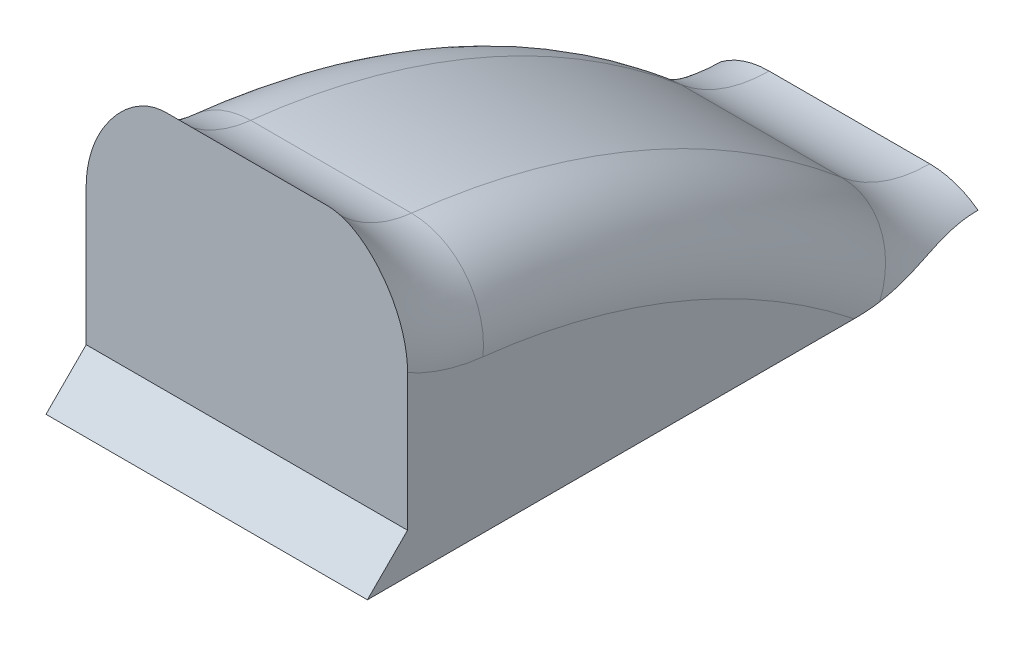
ISO-10303-21;
HEADER;
FILE_DESCRIPTION(('STEP AP214'),'2;1');
FILE_NAME('part.step','',(''),(''),'','','');
FILE_SCHEMA(('AUTOMOTIVE_DESIGN { 1 0 10303 214 1 1 1 1 }'));
ENDSEC;
DATA;
#1=APPLICATION_CONTEXT('core data for automotive mechanical design processes');
#2=APPLICATION_PROTOCOL_DEFINITION('international standard','automotive_design',2000,#1);
#3=PRODUCT_CONTEXT('',#1,'mechanical');
#4=PRODUCT('Part','Part','',(#3));
#5=PRODUCT_RELATED_PRODUCT_CATEGORY('part','',(#4));
#6=PRODUCT_DEFINITION_FORMATION('','',#4);
#7=PRODUCT_DEFINITION_CONTEXT('part definition',#1,'design');
#8=PRODUCT_DEFINITION('design','',#6,#7);
#9=PRODUCT_DEFINITION_SHAPE('','',#8);
#10=(LENGTH_UNIT() NAMED_UNIT(*) SI_UNIT(.MILLI.,.METRE.));
#11=(NAMED_UNIT(*) PLANE_ANGLE_UNIT() SI_UNIT($,.RADIAN.));
#12=(NAMED_UNIT(*) SI_UNIT($,.STERADIAN.) SOLID_ANGLE_UNIT());
#13=UNCERTAINTY_MEASURE_WITH_UNIT(LENGTH_MEASURE(1.E-05),#10,'distance_accuracy_value','');
#14=(GEOMETRIC_REPRESENTATION_CONTEXT(3) GLOBAL_UNCERTAINTY_ASSIGNED_CONTEXT((#13)) GLOBAL_UNIT_ASSIGNED_CONTEXT((#10,
#11,#12)) REPRESENTATION_CONTEXT('',''));
#15=CARTESIAN_POINT('',(0.,0.,0.));
#16=DIRECTION('',(0.,0.,1.));
#17=DIRECTION('',(1.,0.,0.));
#18=AXIS2_PLACEMENT_3D('',#15,#16,#17);
#19=CARTESIAN_POINT('',(1.4,0.05,-0.75));
#20=DIRECTION('',(0.,0.,-1.));
#21=DIRECTION('',(-1.,0.,0.));
#22=AXIS2_PLACEMENT_3D('',#19,#20,#21);
#23=PLANE('',#22);
#24=CARTESIAN_POINT('',(1.29999999996371,0.349999999048817,-0.75));
#25=CARTESIAN_POINT('',(1.30366682566644,0.350010962555197,-0.75));
#26=CARTESIAN_POINT('',(1.30731760266918,0.349658484663443,-0.75));
#27=CARTESIAN_POINT('',(1.31445963130488,0.348333875905218,-0.75));
#28=CARTESIAN_POINT('',(1.31795231543141,0.347369627937569,-0.75));
#29=CARTESIAN_POINT('',(1.32581573405073,0.344539445193765,-0.75));
#30=CARTESIAN_POINT('',(1.33011724918364,0.342485325432599,-0.75));
#31=CARTESIAN_POINT('',(1.33836316301625,0.337722435202768,-0.75));
#32=CARTESIAN_POINT('',(1.34230508863756,0.335009541820298,-0.75));
#33=CARTESIAN_POINT('',(1.35180524001793,0.327545085025619,-0.75));
#34=CARTESIAN_POINT('',(1.35711237091318,0.322475224327267,-0.75));
#35=CARTESIAN_POINT('',(1.36687316443516,0.311585153751797,-0.75));
#36=CARTESIAN_POINT('',(1.37132636992714,0.305764544747223,-0.75));
#37=CARTESIAN_POINT('',(1.37952039118134,0.29330547380315,-0.75));
#38=CARTESIAN_POINT('',(1.38322575195117,0.286643665515981,-0.75));
#39=CARTESIAN_POINT('',(1.38960767096419,0.272857237837241,-0.75));
#40=CARTESIAN_POINT('',(1.39228606539241,0.265733471338296,-0.75));
#41=CARTESIAN_POINT('',(1.39621596370115,0.25218259791091,-0.75));
#42=CARTESIAN_POINT('',(1.39761519714484,0.245798474934751,-0.75));
#43=CARTESIAN_POINT('',(1.39950882532757,0.232881794895136,-0.75));
#44=CARTESIAN_POINT('',(1.40000086172964,0.226348895527605,-0.75));
#45=CARTESIAN_POINT('',(1.40000000021831,0.219805740269375,-0.75));
#46=B_SPLINE_CURVE_WITH_KNOTS('',3,(#24,#25,#26,#27,#28,#29,#30,#31,#32,#33,#34,#35,#36,#37,#38,
#39,#40,#41,#42,#43,#44,#45),.UNSPECIFIED.,.F.,.F.,(4,2,2,2,2,2,2,2,2,2,4),(0.,
0.0109577763831861,0.0217771481085664,0.0359984240459981,0.0503111074095379,0.0722120094925669,
0.0941246033261917,0.116910300510462,0.139655065433205,0.159200017895955,0.178795707897026),.UNSPECIFIED.);
#47=CARTESIAN_POINT('',(1.29999999998186,0.349999999524409,-0.75));
#48=VERTEX_POINT('',#47);
#49=CARTESIAN_POINT('',(1.40000000010916,0.219805740269375,-0.75));
#50=VERTEX_POINT('',#49);
#51=EDGE_CURVE('E117',#48,#50,#46,.T.);
#52=ORIENTED_EDGE('',*,*,#51,.F.);
#53=DIRECTION('',(1.,0.,0.));
#54=VECTOR('',#53,1.);
#55=CARTESIAN_POINT('',(1.2,0.35,-0.75));
#56=LINE('',#55,#54);
#57=CARTESIAN_POINT('',(1.1,0.350000000083016,-0.75));
#58=VERTEX_POINT('',#57);
#59=EDGE_CURVE('E41',#58,#48,#56,.T.);
#60=ORIENTED_EDGE('',*,*,#59,.F.);
#61=CARTESIAN_POINT('',(0.999999999564274,0.219805740269378,-0.749999999853243));
#62=CARTESIAN_POINT('',(0.999998247766929,0.228360205075033,-0.749999999947539));
#63=CARTESIAN_POINT('',(1.00083907547772,0.236890868325082,-0.749999999986003));
#64=CARTESIAN_POINT('',(1.00403300277483,0.253635510569335,-0.750000000013946));
#65=CARTESIAN_POINT('',(1.00638055336717,0.261850534825952,-0.750000000003605));
#66=CARTESIAN_POINT('',(1.01220041097918,0.277188840827321,-0.749999999996654));
#67=CARTESIAN_POINT('',(1.0155796888797,0.284348148963261,-0.74999999999911));
#68=CARTESIAN_POINT('',(1.02339322518595,0.298081117314659,-0.750000000000891));
#69=CARTESIAN_POINT('',(1.02782863452238,0.304654127788376,-0.750000000000214));
#70=CARTESIAN_POINT('',(1.03670776148319,0.315770663251716,-0.749999999999829));
#71=CARTESIAN_POINT('',(1.04097302465008,0.320457374099743,-0.749999999999955));
#72=CARTESIAN_POINT('',(1.05014819138823,0.329156288238541,-0.750000000000045));
#73=CARTESIAN_POINT('',(1.05505698911544,0.333169622278239,-0.75000000000001));
#74=CARTESIAN_POINT('',(1.06366308687047,0.338952671086247,-0.749999999999994));
#75=CARTESIAN_POINT('',(1.06716543545747,0.341011363278786,-0.749999999999998));
#76=CARTESIAN_POINT('',(1.07442725250088,0.344585835244453,-0.750000000000002));
#77=CARTESIAN_POINT('',(1.07818555973303,0.346103894737468,-0.750000000000001));
#78=CARTESIAN_POINT('',(1.08494487476547,0.348151878770666,-0.75));
#79=CARTESIAN_POINT('',(1.08789921415163,0.348834180603575,-0.75));
#80=CARTESIAN_POINT('',(1.09389957039469,0.349763089770758,-0.75));
#81=CARTESIAN_POINT('',(1.09694614249501,0.350006056352736,-0.75));
#82=CARTESIAN_POINT('',(1.1,0.350000000166031,-0.75));
#83=B_SPLINE_CURVE_WITH_KNOTS('',3,(#61,#62,#63,#64,#65,#66,#67,#68,#69,#70,#71,#72,#73,#74,#75,
#76,#77,#78,#79,#80,#81,#82),.UNSPECIFIED.,.F.,.F.,(4,2,2,2,2,2,2,2,2,2,4),(0.,
0.0255893031406178,0.0510849019833463,0.0747469625988365,0.0984349281763469,0.117393594776988,
0.136320099849681,0.148474726827418,0.160577476227118,0.169642719987766,0.178782748632698),.UNSPECIFIED.);
#84=CARTESIAN_POINT('',(0.999999999708758,0.219805740269378,-0.75));
#85=VERTEX_POINT('',#84);
#86=EDGE_CURVE('E130',#85,#58,#83,.T.);
#87=ORIENTED_EDGE('',*,*,#86,.F.);
#88=DIRECTION('',(0.,1.,0.));
#89=VECTOR('',#88,1.);
#90=CARTESIAN_POINT('',(1.,0.2,-0.75));
#91=LINE('',#90,#89);
#92=CARTESIAN_POINT('',(1.,0.0499999998261114,-0.75));
#93=VERTEX_POINT('',#92);
#94=EDGE_CURVE('E123',#93,#85,#91,.T.);
#95=ORIENTED_EDGE('',*,*,#94,.F.);
#96=DIRECTION('',(-1.,0.,0.));
#97=VECTOR('',#96,1.);
#98=CARTESIAN_POINT('',(1.2,0.05,-0.75));
#99=LINE('',#98,#97);
#100=CARTESIAN_POINT('',(1.4,0.05,-0.75));
#101=VERTEX_POINT('',#100);
#102=EDGE_CURVE('E255',#101,#93,#99,.T.);
#103=ORIENTED_EDGE('',*,*,#102,.F.);
#104=DIRECTION('',(0.,-1.,0.));
#105=VECTOR('',#104,1.);
#106=CARTESIAN_POINT('',(1.4,0.2,-0.75));
#107=LINE('',#106,#105);
#108=EDGE_CURVE('E10',#50,#101,#107,.T.);
#109=ORIENTED_EDGE('',*,*,#108,.F.);
#110=EDGE_LOOP('',(#52,#60,#87,#95,#103,#109));
#111=FACE_BOUND('',#110,.T.);
#112=ADVANCED_FACE('F16',(#111),#23,.F.);
#113=CARTESIAN_POINT('',(1.4,0.,-1.309526902));
#114=DIRECTION('',(-1.,0.,0.));
#115=DIRECTION('',(0.,0.,1.));
#116=AXIS2_PLACEMENT_3D('',#113,#114,#115);
#117=PLANE('',#116);
#118=CARTESIAN_POINT('',(1.39999999320173,0.438519467857527,-0.871096251859432));
#119=DIRECTION('',(1.,2.73948942281327E-08,-7.89732137757077E-09));
#120=DIRECTION('',(0.,-0.276997062709012,-0.960870765113904));
#121=AXIS2_PLACEMENT_3D('',#118,#119,#120);
#122=CIRCLE('',#121,0.249999993632357);
#123=CARTESIAN_POINT('',(1.40000000022456,0.190002523524586,-0.843905716822467));
#124=VERTEX_POINT('',#123);
#125=EDGE_CURVE('E119',#50,#124,#122,.T.);
#126=ORIENTED_EDGE('',*,*,#125,.F.);
#127=ORIENTED_EDGE('',*,*,#108,.T.);
#128=DIRECTION('',(0.,0.707106781186547,-0.707106781186548));
#129=VECTOR('',#128,1.);
#130=CARTESIAN_POINT('',(1.4,0.,-0.7));
#131=LINE('',#130,#129);
#132=CARTESIAN_POINT('',(1.4,0.,-0.7));
#133=VERTEX_POINT('',#132);
#134=EDGE_CURVE('E280',#133,#101,#131,.T.);
#135=ORIENTED_EDGE('',*,*,#134,.F.);
#136=DIRECTION('',(0.,0.,1.));
#137=VECTOR('',#136,1.);
#138=CARTESIAN_POINT('',(1.4,0.,-1.0029457765));
#139=LINE('',#138,#137);
#140=CARTESIAN_POINT('',(1.4000000001497,1.06729968966029E-10,-1.30589155215729));
#141=VERTEX_POINT('',#140);
#142=EDGE_CURVE('E135',#141,#133,#139,.T.);
#143=ORIENTED_EDGE('',*,*,#142,.F.);
#144=CARTESIAN_POINT('',(1.39999999677782,-0.70465850155761,-0.746019778698697));
#145=DIRECTION('',(-1.,3.70363621067252E-09,-1.36118372827333E-09));
#146=DIRECTION('',(-1.36118372827333E-09,0.,1.));
#147=AXIS2_PLACEMENT_3D('',#144,#145,#146);
#148=CIRCLE('',#147,0.900000003713054);
#149=EDGE_CURVE('E138',#124,#141,#148,.T.);
#150=ORIENTED_EDGE('',*,*,#149,.F.);
#151=EDGE_LOOP('',(#126,#127,#135,#143,#150));
#152=FACE_BOUND('',#151,.T.);
#153=ADVANCED_FACE('F166',(#152),#117,.F.);
#154=CARTESIAN_POINT('',(1.30000000238547,0.438519488332813,-0.871096262749537));
#155=DIRECTION('',(-1.,9.58108774694143E-09,-5.57717039422708E-09));
#156=DIRECTION('',(-5.57717039422708E-09,0.,1.));
#157=AXIS2_PLACEMENT_3D('',#154,#155,#156);
#158=TOROIDAL_SURFACE('',#157,0.250000016720414,0.100000000603734);
#159=CARTESIAN_POINT('',(1.29999999934489,0.190002522654574,-0.843905716892939));
#160=DIRECTION('',(-1.64677748686025E-09,0.108762150041584,0.99406780187185));
#161=DIRECTION('',(1.,1.51410898573687E-08,0.));
#162=AXIS2_PLACEMENT_3D('',#159,#160,#161);
#163=CIRCLE('',#162,0.100000000879662);
#164=CARTESIAN_POINT('',(1.3,0.289409303716203,-0.854781931992771));
#165=VERTEX_POINT('',#164);
#166=EDGE_CURVE('E32',#124,#165,#163,.T.);
#167=ORIENTED_EDGE('',*,*,#166,.T.);
#168=CARTESIAN_POINT('',(1.3,0.438519474,-0.871096254));
#169=DIRECTION('',(-1.,0.,0.));
#170=DIRECTION('',(0.,0.,1.));
#171=AXIS2_PLACEMENT_3D('',#168,#169,#170);
#172=CIRCLE('',#171,0.15);
#173=EDGE_CURVE('E115',#165,#48,#172,.T.);
#174=ORIENTED_EDGE('',*,*,#173,.T.);
#175=ORIENTED_EDGE('',*,*,#51,.T.);
#176=ORIENTED_EDGE('',*,*,#125,.T.);
#177=EDGE_LOOP('',(#167,#174,#175,#176));
#178=FACE_BOUND('',#177,.T.);
#179=ADVANCED_FACE('F162',(#178),#158,.T.);
#180=CARTESIAN_POINT('',(1.3,0.438519474,-0.871096254));
#181=DIRECTION('',(-1.,0.,0.));
#182=DIRECTION('',(0.,0.,1.));
#183=AXIS2_PLACEMENT_3D('',#180,#181,#182);
#184=CYLINDRICAL_SURFACE('',#183,0.15);
#185=DIRECTION('',(-1.,0.,0.));
#186=VECTOR('',#185,1.);
#187=CARTESIAN_POINT('',(1.2,0.28940930373128,-0.854781931383557));
#188=LINE('',#187,#186);
#189=CARTESIAN_POINT('',(1.1,0.289409303740005,-0.854781931735455));
#190=VERTEX_POINT('',#189);
#191=EDGE_CURVE('E122',#165,#190,#188,.T.);
#192=ORIENTED_EDGE('',*,*,#191,.T.);
#193=CARTESIAN_POINT('',(1.1,0.438519474,-0.871096254));
#194=DIRECTION('',(-1.,0.,0.));
#195=DIRECTION('',(0.,0.,1.));
#196=AXIS2_PLACEMENT_3D('',#193,#194,#195);
#197=CIRCLE('',#196,0.15);
#198=EDGE_CURVE('E113',#190,#58,#197,.T.);
#199=ORIENTED_EDGE('',*,*,#198,.T.);
#200=ORIENTED_EDGE('',*,*,#59,.T.);
#201=ORIENTED_EDGE('',*,*,#173,.F.);
#202=EDGE_LOOP('',(#192,#199,#200,#201));
#203=FACE_BOUND('',#202,.T.);
#204=ADVANCED_FACE('F165',(#203),#184,.F.);
#205=CARTESIAN_POINT('',(1.10000000435835,0.438519474164285,-0.871096254107821));
#206=DIRECTION('',(-1.,1.32995734944344E-08,-1.07817005528664E-08));
#207=DIRECTION('',(-1.07817005528664E-08,0.,1.));
#208=AXIS2_PLACEMENT_3D('',#205,#206,#207);
#209=TOROIDAL_SURFACE('',#208,0.250000000845989,0.100000000726411);
#210=CARTESIAN_POINT('',(1.1000000006488,0.190002522694578,-0.843905716545499));
#211=DIRECTION('',(-1.85051383629767E-09,0.108762150949675,0.994067801772495));
#212=DIRECTION('',(1.,1.70143181257413E-08,0.));
#213=AXIS2_PLACEMENT_3D('',#210,#211,#212);
#214=CIRCLE('',#213,0.100000000873359);
#215=CARTESIAN_POINT('',(0.999999999775443,0.190002523524592,-0.843905716822468));
#216=VERTEX_POINT('',#215);
#217=EDGE_CURVE('E114',#190,#216,#214,.T.);
#218=ORIENTED_EDGE('',*,*,#217,.T.);
#219=CARTESIAN_POINT('',(1.00000000679827,0.438519467857873,-0.871096251859535));
#220=DIRECTION('',(-1.,2.73949080004724E-08,-7.89732427070734E-09));
#221=DIRECTION('',(-7.89732427070735E-09,0.,1.));
#222=AXIS2_PLACEMENT_3D('',#219,#220,#221);
#223=CIRCLE('',#222,0.249999993632707);
#224=EDGE_CURVE('E127',#216,#85,#223,.T.);
#225=ORIENTED_EDGE('',*,*,#224,.T.);
#226=ORIENTED_EDGE('',*,*,#86,.T.);
#227=ORIENTED_EDGE('',*,*,#198,.F.);
#228=EDGE_LOOP('',(#218,#225,#226,#227));
#229=FACE_BOUND('',#228,.T.);
#230=ADVANCED_FACE('F168',(#229),#209,.T.);
#231=CARTESIAN_POINT('',(1.,0.,-1.309526902));
#232=DIRECTION('',(-1.,0.,0.));
#233=DIRECTION('',(0.,0.,1.));
#234=AXIS2_PLACEMENT_3D('',#231,#232,#233);
#235=PLANE('',#234);
#236=DIRECTION('',(0.,0.,1.));
#237=VECTOR('',#236,1.);
#238=CARTESIAN_POINT('',(1.,0.,-1.0029457765));
#239=LINE('',#238,#237);
#240=CARTESIAN_POINT('',(0.999999999850296,1.06732190671243E-10,-1.30589155215729));
#241=VERTEX_POINT('',#240);
#242=CARTESIAN_POINT('',(1.,0.,-0.700000000232245));
#243=VERTEX_POINT('',#242);
#244=EDGE_CURVE('E257',#241,#243,#239,.T.);
#245=ORIENTED_EDGE('',*,*,#244,.T.);
#246=DIRECTION('',(0.,0.707106782011833,-0.707106780361262));
#247=VECTOR('',#246,1.);
#248=CARTESIAN_POINT('',(1.,0.,-0.70000000046449));
#249=LINE('',#248,#247);
#250=EDGE_CURVE('E125',#243,#93,#249,.T.);
#251=ORIENTED_EDGE('',*,*,#250,.T.);
#252=ORIENTED_EDGE('',*,*,#94,.T.);
#253=ORIENTED_EDGE('',*,*,#224,.F.);
#254=CARTESIAN_POINT('',(0.999999999625734,-0.704658501731185,-0.746019778627308));
#255=DIRECTION('',(-1.,0.,0.));
#256=DIRECTION('',(0.,0.,1.));
#257=AXIS2_PLACEMENT_3D('',#254,#255,#256);
#258=CIRCLE('',#257,0.900000003893368);
#259=EDGE_CURVE('E126',#216,#241,#258,.T.);
#260=ORIENTED_EDGE('',*,*,#259,.T.);
#261=EDGE_LOOP('',(#245,#251,#252,#253,#260));
#262=FACE_BOUND('',#261,.T.);
#263=ADVANCED_FACE('F172',(#262),#235,.T.);
#264=CARTESIAN_POINT('',(1.,0.,-0.7));
#265=DIRECTION('',(0.,-0.707106781186548,-0.707106781186547));
#266=DIRECTION('',(0.,0.707106781186547,-0.707106781186548));
#267=AXIS2_PLACEMENT_3D('',#264,#265,#266);
#268=PLANE('',#267);
#269=DIRECTION('',(-1.,0.,0.));
#270=VECTOR('',#269,1.);
#271=CARTESIAN_POINT('',(1.2,0.,-0.7));
#272=LINE('',#271,#270);
#273=EDGE_CURVE('E142',#133,#243,#272,.T.);
#274=ORIENTED_EDGE('',*,*,#273,.F.);
#275=ORIENTED_EDGE('',*,*,#134,.T.);
#276=ORIENTED_EDGE('',*,*,#102,.T.);
#277=ORIENTED_EDGE('',*,*,#250,.F.);
#278=EDGE_LOOP('',(#274,#275,#276,#277));
#279=FACE_BOUND('',#278,.T.);
#280=ADVANCED_FACE('F176',(#279),#268,.F.);
#281=CARTESIAN_POINT('',(1.29999998873894,-0.704658501672842,-0.746019779083307));
#282=DIRECTION('',(-1.,1.12063119226131E-08,-5.33132747395985E-09));
#283=DIRECTION('',(-5.33132747395985E-09,0.,1.));
#284=AXIS2_PLACEMENT_3D('',#281,#282,#283);
#285=TOROIDAL_SURFACE('',#284,0.900000003158881,0.100000000659206);
#286=CARTESIAN_POINT('',(1.3,-0.704658498,-0.746019781));
#287=DIRECTION('',(1.,0.,0.));
#288=DIRECTION('',(0.,1.,0.));
#289=AXIS2_PLACEMENT_3D('',#286,#287,#288);
#290=CIRCLE('',#289,1.);
#291=CARTESIAN_POINT('',(1.29999999983795,0.0600068855505894,-1.39044731903608));
#292=VERTEX_POINT('',#291);
#293=EDGE_CURVE('E269',#292,#165,#290,.T.);
#294=ORIENTED_EDGE('',*,*,#293,.T.);
#295=ORIENTED_EDGE('',*,*,#166,.F.);
#296=ORIENTED_EDGE('',*,*,#149,.T.);
#297=CARTESIAN_POINT('',(1.26725378279648,4.82933203578017E-06,-1.26792166906526));
#298=DIRECTION('',(3.56775383122088E-05,0.999999999360546,-2.45370887951204E-06));
#299=DIRECTION('',(-0.251034196127656,1.13314189081304E-05,0.967978218890353));
#300=AXIS2_PLACEMENT_3D('',#297,#298,#299);
#301=ELLIPSE('',#300,0.192501481850988,0.127727873122096);
#302=CARTESIAN_POINT('',(1.39765583122285,1.76410812414225E-10,-1.33987606238192));
#303=VERTEX_POINT('',#302);
#304=EDGE_CURVE('E134',#141,#303,#301,.T.);
#305=ORIENTED_EDGE('',*,*,#304,.T.);
#306=CARTESIAN_POINT('',(1.30000000008808,-0.016459653035172,-1.32600456474559));
#307=DIRECTION('',(2.21490811533198E-09,0.644427539559284,0.764665381887769));
#308=DIRECTION('',(1.,-3.43701654470995E-09,0.));
#309=AXIS2_PLACEMENT_3D('',#306,#307,#308);
#310=CIRCLE('',#309,0.0999999999257083);
#311=EDGE_CURVE('E132',#303,#292,#310,.T.);
#312=ORIENTED_EDGE('',*,*,#311,.T.);
#313=EDGE_LOOP('',(#294,#295,#296,#305,#312));
#314=FACE_BOUND('',#313,.T.);
#315=ADVANCED_FACE('F180',(#314),#285,.T.);
#316=CARTESIAN_POINT('',(1.,0.,-1.5));
#317=DIRECTION('',(0.,1.,0.));
#318=DIRECTION('',(0.,0.,1.));
#319=AXIS2_PLACEMENT_3D('',#316,#317,#318);
#320=PLANE('',#319);
#321=CARTESIAN_POINT('',(1.39765583143209,7.75888527726202E-12,-1.33987606242378));
#322=CARTESIAN_POINT('',(1.39574329210156,2.79853312034865E-12,-1.35359765542458));
#323=CARTESIAN_POINT('',(1.39270495277309,7.525616730333E-13,-1.36701330806974));
#324=CARTESIAN_POINT('',(1.38547676963315,-7.50718087568285E-13,-1.39351273770047));
#325=CARTESIAN_POINT('',(1.38128976494919,-2.1435568997034E-13,-1.40659724718638));
#326=CARTESIAN_POINT('',(1.37285246859131,2.13940822870456E-13,-1.43275323014791));
#327=CARTESIAN_POINT('',(1.36860231508774,1.07120164801319E-13,-1.44582467984127));
#328=CARTESIAN_POINT('',(1.36218375676619,-1.07420511300137E-13,-1.47244941745509));
#329=CARTESIAN_POINT('',(1.36002122222544,-2.1514221121763E-13,-1.48600395360643));
#330=CARTESIAN_POINT('',(1.36000000199714,0.,-1.50000000003934));
#331=B_SPLINE_CURVE_WITH_KNOTS('',3,(#321,#322,#323,#324,#325,#326,#327,#328,#329,#330),
.UNSPECIFIED.,.F.,.F.,(4,2,2,2,4),(0.,0.041301985462867,0.0825027915463647,0.123623856994402,
0.16486021882968),.UNSPECIFIED.);
#332=CARTESIAN_POINT('',(1.36000000103883,0.,-1.5));
#333=VERTEX_POINT('',#332);
#334=EDGE_CURVE('E144',#303,#333,#331,.T.);
#335=ORIENTED_EDGE('',*,*,#334,.F.);
#336=ORIENTED_EDGE('',*,*,#304,.F.);
#337=ORIENTED_EDGE('',*,*,#142,.T.);
#338=ORIENTED_EDGE('',*,*,#273,.T.);
#339=ORIENTED_EDGE('',*,*,#244,.F.);
#340=CARTESIAN_POINT('',(1.13274621592142,4.82934049348366E-06,-1.26792166955495));
#341=DIRECTION('',(-3.56776011007931E-05,0.999999999360544,-2.45371328976826E-06));
#342=DIRECTION('',(0.251034191826607,1.133143878853E-05,0.967978220005781));
#343=AXIS2_PLACEMENT_3D('',#340,#341,#342);
#344=ELLIPSE('',#343,0.192501480751404,0.127727871998602);
#345=CARTESIAN_POINT('',(1.00234416836825,1.76407778150509E-10,-1.33987606246848));
#346=VERTEX_POINT('',#345);
#347=EDGE_CURVE('E139',#346,#241,#344,.T.);
#348=ORIENTED_EDGE('',*,*,#347,.F.);
#349=CARTESIAN_POINT('',(1.03999999965055,-6.56253063279773E-11,-1.5));
#350=CARTESIAN_POINT('',(1.04004597569619,-2.33406330731563E-11,-1.48930345575476));
#351=CARTESIAN_POINT('',(1.03875440539985,-6.20062217714809E-12,-1.47880084529949));
#352=CARTESIAN_POINT('',(1.03460612218242,6.1852339416473E-12,-1.45810774816051));
#353=CARTESIAN_POINT('',(1.03175330146874,1.48530888563393E-12,-1.44791655155673));
#354=CARTESIAN_POINT('',(1.02619964198971,-1.18788775882662E-12,-1.42974070668906));
#355=CARTESIAN_POINT('',(1.02358275914032,-3.19665350618915E-13,-1.42172284962131));
#356=CARTESIAN_POINT('',(1.01842761828237,3.19201687154103E-13,-1.4056684531106));
#357=CARTESIAN_POINT('',(1.01588925173673,0.,-1.39763195763414));
#358=CARTESIAN_POINT('',(1.01115366448675,0.,-1.38140817505881));
#359=CARTESIAN_POINT('',(1.00895832138597,0.,-1.37322031482557));
#360=CARTESIAN_POINT('',(1.00514951874,0.,-1.35667382996041));
#361=CARTESIAN_POINT('',(1.00353876184194,0.,-1.34831459632207));
#362=CARTESIAN_POINT('',(1.00234416807406,0.,-1.33987606252661));
#363=B_SPLINE_CURVE_WITH_KNOTS('',3,(#349,#350,#351,#352,#353,#354,#355,#356,#357,#358,#359,
#360,#361,#362),.UNSPECIFIED.,.F.,.F.,(4,2,2,2,2,2,4),(0.,0.0317329534796246,0.0633871545134367,
0.0887028570499189,0.113981840040943,0.139394679923025,0.164923554726602),.UNSPECIFIED.);
#364=CARTESIAN_POINT('',(1.03999999977284,0.,-1.5));
#365=VERTEX_POINT('',#364);
#366=EDGE_CURVE('E20',#365,#346,#363,.T.);
#367=ORIENTED_EDGE('',*,*,#366,.F.);
#368=DIRECTION('',(-1.,0.,0.));
#369=VECTOR('',#368,1.);
#370=CARTESIAN_POINT('',(1.2,0.,-1.5));
#371=LINE('',#370,#369);
#372=EDGE_CURVE('E102',#333,#365,#371,.T.);
#373=ORIENTED_EDGE('',*,*,#372,.F.);
#374=EDGE_LOOP('',(#335,#336,#337,#338,#339,#348,#367,#373));
#375=FACE_BOUND('',#374,.T.);
#376=ADVANCED_FACE('F183',(#375),#320,.F.);
#377=CARTESIAN_POINT('',(1.3,-0.704658498,-0.746019781));
#378=DIRECTION('',(-1.,0.,0.));
#379=DIRECTION('',(0.,0.,1.));
#380=AXIS2_PLACEMENT_3D('',#377,#378,#379);
#381=CYLINDRICAL_SURFACE('',#380,1.);
#382=ORIENTED_EDGE('',*,*,#293,.F.);
#383=DIRECTION('',(1.,0.,0.));
#384=VECTOR('',#383,1.);
#385=CARTESIAN_POINT('',(1.2,0.0600068850933383,-1.39044731912878));
#386=LINE('',#385,#384);
#387=CARTESIAN_POINT('',(1.10000000015882,0.060006885059415,-1.3904473187215));
#388=VERTEX_POINT('',#387);
#389=EDGE_CURVE('E81',#388,#292,#386,.T.);
#390=ORIENTED_EDGE('',*,*,#389,.F.);
#391=CARTESIAN_POINT('',(1.1,-0.704658498,-0.746019781));
#392=DIRECTION('',(-1.,0.,0.));
#393=DIRECTION('',(0.,0.,1.));
#394=AXIS2_PLACEMENT_3D('',#391,#392,#393);
#395=CIRCLE('',#394,1.);
#396=EDGE_CURVE('E143',#190,#388,#395,.T.);
#397=ORIENTED_EDGE('',*,*,#396,.F.);
#398=ORIENTED_EDGE('',*,*,#191,.F.);
#399=EDGE_LOOP('',(#382,#390,#397,#398));
#400=FACE_BOUND('',#399,.T.);
#401=ADVANCED_FACE('F188',(#400),#381,.T.);
#402=CARTESIAN_POINT('',(1.09999999613649,-0.704658470438161,-0.746019792650712));
#403=DIRECTION('',(-1.,4.21287282480593E-09,-2.00870327527895E-09));
#404=DIRECTION('',(-2.00870327527895E-09,0.,1.));
#405=AXIS2_PLACEMENT_3D('',#402,#403,#404);
#406=TOROIDAL_SURFACE('',#405,0.899999969770152,0.100000000549535);
#407=ORIENTED_EDGE('',*,*,#347,.T.);
#408=ORIENTED_EDGE('',*,*,#259,.F.);
#409=ORIENTED_EDGE('',*,*,#217,.F.);
#410=ORIENTED_EDGE('',*,*,#396,.T.);
#411=CARTESIAN_POINT('',(1.09999999993755,-0.0164596531324671,-1.32600456484148));
#412=DIRECTION('',(-9.54348710699726E-10,0.644427539100127,0.764665382274727));
#413=DIRECTION('',(1.,1.48092477865296E-09,0.));
#414=AXIS2_PLACEMENT_3D('',#411,#412,#413);
#415=CIRCLE('',#414,0.0999999999534559);
#416=EDGE_CURVE('E106',#388,#346,#415,.T.);
#417=ORIENTED_EDGE('',*,*,#416,.T.);
#418=EDGE_LOOP('',(#407,#408,#409,#410,#417));
#419=FACE_BOUND('',#418,.T.);
#420=ADVANCED_FACE('F189',(#419),#406,.T.);
#421=CARTESIAN_POINT('',(1.29999998868463,0.189999953692856,-1.49999998344538));
#422=DIRECTION('',(-0.999999999999999,-3.68975654624189E-08,1.52927371689047E-08));
#423=DIRECTION('',(-3.6897565462419E-08,0.999999999999999,0.));
#424=AXIS2_PLACEMENT_3D('',#421,#422,#423);
#425=TOROIDAL_SURFACE('',#424,0.269999952345513,0.100000000930742);
#426=ORIENTED_EDGE('',*,*,#311,.F.);
#427=ORIENTED_EDGE('',*,*,#334,.T.);
#428=CARTESIAN_POINT('',(1.29999999921054,-0.0800000003339496,-1.49999999999999));
#429=DIRECTION('',(0.,1.27781332010598E-13,1.));
#430=DIRECTION('',(1.,0.,0.));
#431=AXIS2_PLACEMENT_3D('',#428,#429,#430);
#432=CIRCLE('',#431,0.100000000790634);
#433=CARTESIAN_POINT('',(1.29999999989674,0.0200000008354761,-1.5));
#434=VERTEX_POINT('',#433);
#435=EDGE_CURVE('E146',#333,#434,#432,.T.);
#436=ORIENTED_EDGE('',*,*,#435,.T.);
#437=CARTESIAN_POINT('',(1.3,0.19,-1.5));
#438=DIRECTION('',(-1.,0.,0.));
#439=DIRECTION('',(0.,0.,1.));
#440=AXIS2_PLACEMENT_3D('',#437,#438,#439);
#441=CIRCLE('',#440,0.17);
#442=EDGE_CURVE('E90',#434,#292,#441,.T.);
#443=ORIENTED_EDGE('',*,*,#442,.T.);
#444=EDGE_LOOP('',(#426,#427,#436,#443));
#445=FACE_BOUND('',#444,.T.);
#446=ADVANCED_FACE('F197',(#445),#425,.T.);
#447=CARTESIAN_POINT('',(1.03808,0.,-1.5));
#448=DIRECTION('',(0.,0.,1.));
#449=DIRECTION('',(1.,0.,0.));
#450=AXIS2_PLACEMENT_3D('',#447,#448,#449);
#451=PLANE('',#450);
#452=ORIENTED_EDGE('',*,*,#435,.F.);
#453=ORIENTED_EDGE('',*,*,#372,.T.);
#454=CARTESIAN_POINT('',(1.10000000078946,-0.0800000003339491,-1.50000000000001));
#455=DIRECTION('',(0.,0.,1.));
#456=DIRECTION('',(1.,0.,0.));
#457=AXIS2_PLACEMENT_3D('',#454,#455,#456);
#458=CIRCLE('',#457,0.100000000790633);
#459=CARTESIAN_POINT('',(1.10000000010326,0.0200000002283421,-1.5));
#460=VERTEX_POINT('',#459);
#461=EDGE_CURVE('E100',#460,#365,#458,.T.);
#462=ORIENTED_EDGE('',*,*,#461,.F.);
#463=DIRECTION('',(-1.,0.,0.));
#464=VECTOR('',#463,1.);
#465=CARTESIAN_POINT('',(1.2,0.02,-1.5));
#466=LINE('',#465,#464);
#467=EDGE_CURVE('E93',#434,#460,#466,.T.);
#468=ORIENTED_EDGE('',*,*,#467,.F.);
#469=EDGE_LOOP('',(#452,#453,#462,#468));
#470=FACE_BOUND('',#469,.T.);
#471=ADVANCED_FACE('F101',(#470),#451,.F.);
#472=CARTESIAN_POINT('',(1.09999999290382,0.190000000732105,-1.49999999962459));
#473=DIRECTION('',(-1.,-2.83947493945275E-08,6.97816668147152E-09));
#474=DIRECTION('',(-2.83947493945275E-08,1.,0.));
#475=AXIS2_PLACEMENT_3D('',#472,#473,#474);
#476=TOROIDAL_SURFACE('',#475,0.270000001186589,0.10000000092862);
#477=ORIENTED_EDGE('',*,*,#416,.F.);
#478=CARTESIAN_POINT('',(1.1,0.19,-1.5));
#479=DIRECTION('',(1.,0.,0.));
#480=DIRECTION('',(0.,1.,0.));
#481=AXIS2_PLACEMENT_3D('',#478,#479,#480);
#482=CIRCLE('',#481,0.17);
#483=EDGE_CURVE('E96',#388,#460,#482,.T.);
#484=ORIENTED_EDGE('',*,*,#483,.T.);
#485=ORIENTED_EDGE('',*,*,#461,.T.);
#486=ORIENTED_EDGE('',*,*,#366,.T.);
#487=EDGE_LOOP('',(#477,#484,#485,#486));
#488=FACE_BOUND('',#487,.T.);
#489=ADVANCED_FACE('F104',(#488),#476,.T.);
#490=CARTESIAN_POINT('',(1.3,0.19,-1.5));
#491=DIRECTION('',(-1.,0.,0.));
#492=DIRECTION('',(0.,0.,1.));
#493=AXIS2_PLACEMENT_3D('',#490,#491,#492);
#494=CYLINDRICAL_SURFACE('',#493,0.17);
#495=ORIENTED_EDGE('',*,*,#467,.T.);
#496=ORIENTED_EDGE('',*,*,#483,.F.);
#497=ORIENTED_EDGE('',*,*,#389,.T.);
#498=ORIENTED_EDGE('',*,*,#442,.F.);
#499=EDGE_LOOP('',(#495,#496,#497,#498));
#500=FACE_BOUND('',#499,.T.);
#501=ADVANCED_FACE('F18',(#500),#494,.F.);
#502=CLOSED_SHELL('',(#112,#153,#179,#204,#230,#263,#280,#315,#376,#401,#420,#446,#471,#489,#501));
#503=MANIFOLD_SOLID_BREP('B1',#502);
#504=ADVANCED_BREP_SHAPE_REPRESENTATION('',(#18,#503),#14);
#505=SHAPE_DEFINITION_REPRESENTATION(#9,#504);
ENDSEC;
END-ISO-10303-21;
